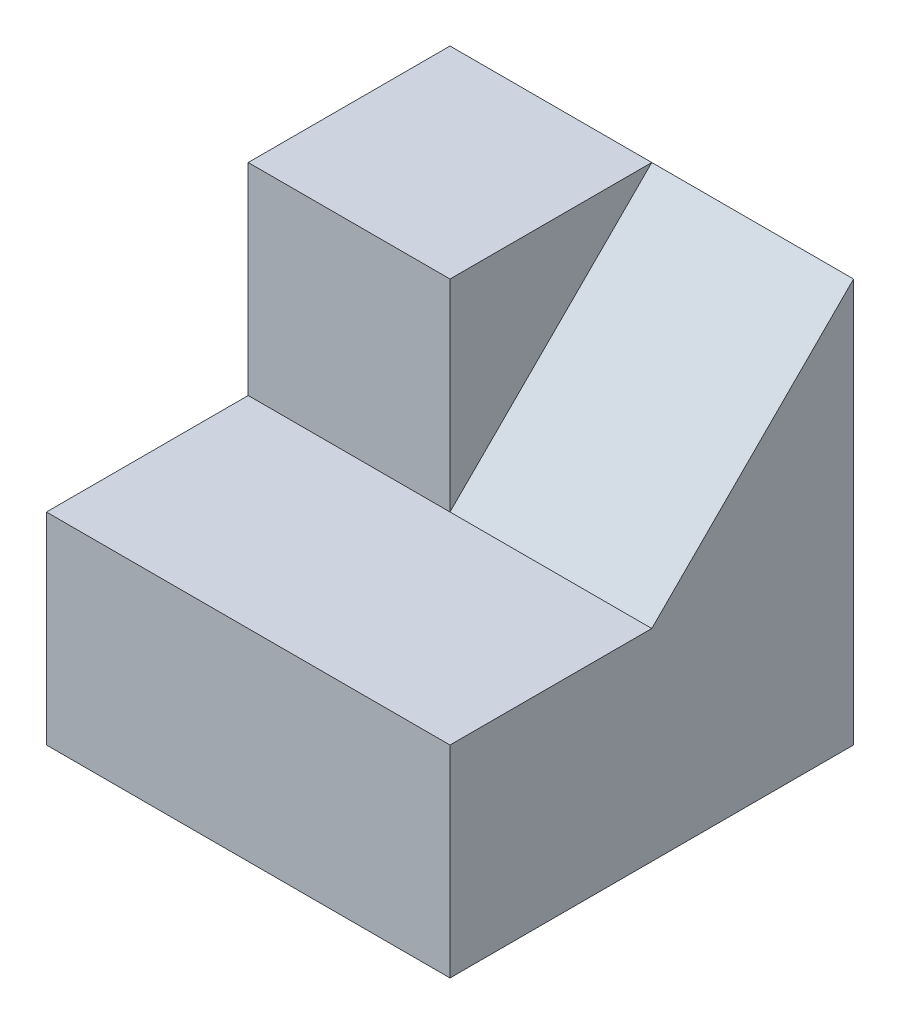
ISO-10303-21;
HEADER;
FILE_DESCRIPTION(('STEP AP214'),'2;1');
FILE_NAME('part.step','',(''),(''),'','','');
FILE_SCHEMA(('AUTOMOTIVE_DESIGN { 1 0 10303 214 1 1 1 1 }'));
ENDSEC;
DATA;
#1=APPLICATION_CONTEXT('core data for automotive mechanical design processes');
#2=APPLICATION_PROTOCOL_DEFINITION('international standard','automotive_design',2000,#1);
#3=PRODUCT_CONTEXT('',#1,'mechanical');
#4=PRODUCT('Part','Part','',(#3));
#5=PRODUCT_RELATED_PRODUCT_CATEGORY('part','',(#4));
#6=PRODUCT_DEFINITION_FORMATION('','',#4);
#7=PRODUCT_DEFINITION_CONTEXT('part definition',#1,'design');
#8=PRODUCT_DEFINITION('design','',#6,#7);
#9=PRODUCT_DEFINITION_SHAPE('','',#8);
#10=(LENGTH_UNIT() NAMED_UNIT(*) SI_UNIT(.MILLI.,.METRE.));
#11=(NAMED_UNIT(*) PLANE_ANGLE_UNIT() SI_UNIT($,.RADIAN.));
#12=(NAMED_UNIT(*) SI_UNIT($,.STERADIAN.) SOLID_ANGLE_UNIT());
#13=UNCERTAINTY_MEASURE_WITH_UNIT(LENGTH_MEASURE(1.E-05),#10,'distance_accuracy_value','');
#14=(GEOMETRIC_REPRESENTATION_CONTEXT(3) GLOBAL_UNCERTAINTY_ASSIGNED_CONTEXT((#13)) GLOBAL_UNIT_ASSIGNED_CONTEXT((#10,
#11,#12)) REPRESENTATION_CONTEXT('',''));
#15=CARTESIAN_POINT('',(0.,0.,0.));
#16=DIRECTION('',(0.,0.,1.));
#17=DIRECTION('',(1.,0.,0.));
#18=AXIS2_PLACEMENT_3D('',#15,#16,#17);
#19=CARTESIAN_POINT('',(20.,20.,-20.));
#20=DIRECTION('',(-1.,0.,0.));
#21=DIRECTION('',(0.,0.,1.));
#22=AXIS2_PLACEMENT_3D('',#19,#20,#21);
#23=PLANE('',#22);
#24=DIRECTION('',(0.,0.,-1.));
#25=VECTOR('',#24,1.);
#26=CARTESIAN_POINT('',(20.,0.,-20.));
#27=LINE('',#26,#25);
#28=CARTESIAN_POINT('',(20.,0.,20.));
#29=VERTEX_POINT('',#28);
#30=CARTESIAN_POINT('',(20.,0.,-20.));
#31=VERTEX_POINT('',#30);
#32=EDGE_CURVE('E95',#29,#31,#27,.T.);
#33=ORIENTED_EDGE('',*,*,#32,.T.);
#34=DIRECTION('',(0.,-1.,0.));
#35=VECTOR('',#34,1.);
#36=CARTESIAN_POINT('',(20.,20.,-20.));
#37=LINE('',#36,#35);
#38=CARTESIAN_POINT('',(20.,40.,-20.));
#39=VERTEX_POINT('',#38);
#40=EDGE_CURVE('E11',#39,#31,#37,.T.);
#41=ORIENTED_EDGE('',*,*,#40,.F.);
#42=DIRECTION('',(0.,-0.707106781186547,0.707106781186548));
#43=VECTOR('',#42,1.);
#44=CARTESIAN_POINT('',(20.,40.,-20.));
#45=LINE('',#44,#43);
#46=CARTESIAN_POINT('',(20.,20.,0.));
#47=VERTEX_POINT('',#46);
#48=EDGE_CURVE('E157',#39,#47,#45,.T.);
#49=ORIENTED_EDGE('',*,*,#48,.T.);
#50=DIRECTION('',(0.,0.,-1.));
#51=VECTOR('',#50,1.);
#52=CARTESIAN_POINT('',(20.,20.,-20.));
#53=LINE('',#52,#51);
#54=CARTESIAN_POINT('',(20.,20.,20.));
#55=VERTEX_POINT('',#54);
#56=EDGE_CURVE('E89',#55,#47,#53,.T.);
#57=ORIENTED_EDGE('',*,*,#56,.F.);
#58=DIRECTION('',(0.,-1.,0.));
#59=VECTOR('',#58,1.);
#60=CARTESIAN_POINT('',(20.,20.,20.));
#61=LINE('',#60,#59);
#62=EDGE_CURVE('E82',#55,#29,#61,.T.);
#63=ORIENTED_EDGE('',*,*,#62,.T.);
#64=EDGE_LOOP('',(#33,#41,#49,#57,#63));
#65=FACE_BOUND('',#64,.T.);
#66=ADVANCED_FACE('F39',(#65),#23,.F.);
#67=CARTESIAN_POINT('',(-20.,20.,-20.));
#68=DIRECTION('',(0.,0.,1.));
#69=DIRECTION('',(1.,0.,0.));
#70=AXIS2_PLACEMENT_3D('',#67,#68,#69);
#71=PLANE('',#70);
#72=DIRECTION('',(-1.,0.,0.));
#73=VECTOR('',#72,1.);
#74=CARTESIAN_POINT('',(-20.,0.,-20.));
#75=LINE('',#74,#73);
#76=CARTESIAN_POINT('',(-20.,0.,-20.));
#77=VERTEX_POINT('',#76);
#78=EDGE_CURVE('E99',#31,#77,#75,.T.);
#79=ORIENTED_EDGE('',*,*,#78,.T.);
#80=DIRECTION('',(0.,-1.,0.));
#81=VECTOR('',#80,1.);
#82=CARTESIAN_POINT('',(-20.,20.,-20.));
#83=LINE('',#82,#81);
#84=CARTESIAN_POINT('',(-20.,40.,-20.));
#85=VERTEX_POINT('',#84);
#86=EDGE_CURVE('E46',#85,#77,#83,.T.);
#87=ORIENTED_EDGE('',*,*,#86,.F.);
#88=DIRECTION('',(-1.,0.,0.));
#89=VECTOR('',#88,1.);
#90=CARTESIAN_POINT('',(-20.,40.,-20.));
#91=LINE('',#90,#89);
#92=CARTESIAN_POINT('',(0.,40.,-20.));
#93=VERTEX_POINT('',#92);
#94=EDGE_CURVE('E124',#93,#85,#91,.T.);
#95=ORIENTED_EDGE('',*,*,#94,.F.);
#96=DIRECTION('',(1.,0.,0.));
#97=VECTOR('',#96,1.);
#98=CARTESIAN_POINT('',(0.,40.,-20.));
#99=LINE('',#98,#97);
#100=EDGE_CURVE('E152',#93,#39,#99,.T.);
#101=ORIENTED_EDGE('',*,*,#100,.T.);
#102=ORIENTED_EDGE('',*,*,#40,.T.);
#103=EDGE_LOOP('',(#79,#87,#95,#101,#102));
#104=FACE_BOUND('',#103,.T.);
#105=ADVANCED_FACE('F121',(#104),#71,.F.);
#106=CARTESIAN_POINT('',(-20.,20.,-20.));
#107=DIRECTION('',(1.,0.,0.));
#108=DIRECTION('',(0.,0.,-1.));
#109=AXIS2_PLACEMENT_3D('',#106,#107,#108);
#110=PLANE('',#109);
#111=DIRECTION('',(0.,0.,1.));
#112=VECTOR('',#111,1.);
#113=CARTESIAN_POINT('',(-20.,0.,-20.));
#114=LINE('',#113,#112);
#115=CARTESIAN_POINT('',(-20.,0.,20.));
#116=VERTEX_POINT('',#115);
#117=EDGE_CURVE('E90',#77,#116,#114,.T.);
#118=ORIENTED_EDGE('',*,*,#117,.T.);
#119=DIRECTION('',(0.,-1.,0.));
#120=VECTOR('',#119,1.);
#121=CARTESIAN_POINT('',(-20.,20.,20.));
#122=LINE('',#121,#120);
#123=CARTESIAN_POINT('',(-20.,20.,20.));
#124=VERTEX_POINT('',#123);
#125=EDGE_CURVE('E85',#124,#116,#122,.T.);
#126=ORIENTED_EDGE('',*,*,#125,.F.);
#127=DIRECTION('',(0.,0.,1.));
#128=VECTOR('',#127,1.);
#129=CARTESIAN_POINT('',(-20.,20.,-20.));
#130=LINE('',#129,#128);
#131=CARTESIAN_POINT('',(-20.,20.,0.));
#132=VERTEX_POINT('',#131);
#133=EDGE_CURVE('E142',#132,#124,#130,.T.);
#134=ORIENTED_EDGE('',*,*,#133,.F.);
#135=DIRECTION('',(0.,-1.,0.));
#136=VECTOR('',#135,1.);
#137=CARTESIAN_POINT('',(-20.,40.,0.));
#138=LINE('',#137,#136);
#139=CARTESIAN_POINT('',(-20.,40.,0.));
#140=VERTEX_POINT('',#139);
#141=EDGE_CURVE('E100',#140,#132,#138,.T.);
#142=ORIENTED_EDGE('',*,*,#141,.F.);
#143=DIRECTION('',(0.,0.,1.));
#144=VECTOR('',#143,1.);
#145=CARTESIAN_POINT('',(-20.,40.,-20.));
#146=LINE('',#145,#144);
#147=EDGE_CURVE('E117',#85,#140,#146,.T.);
#148=ORIENTED_EDGE('',*,*,#147,.F.);
#149=ORIENTED_EDGE('',*,*,#86,.T.);
#150=EDGE_LOOP('',(#118,#126,#134,#142,#148,#149));
#151=FACE_BOUND('',#150,.T.);
#152=ADVANCED_FACE('F114',(#151),#110,.F.);
#153=CARTESIAN_POINT('',(-20.,20.,20.));
#154=DIRECTION('',(0.,0.,-1.));
#155=DIRECTION('',(-1.,0.,0.));
#156=AXIS2_PLACEMENT_3D('',#153,#154,#155);
#157=PLANE('',#156);
#158=DIRECTION('',(1.,0.,0.));
#159=VECTOR('',#158,1.);
#160=CARTESIAN_POINT('',(-20.,0.,20.));
#161=LINE('',#160,#159);
#162=EDGE_CURVE('E79',#116,#29,#161,.T.);
#163=ORIENTED_EDGE('',*,*,#162,.T.);
#164=ORIENTED_EDGE('',*,*,#62,.F.);
#165=DIRECTION('',(1.,0.,0.));
#166=VECTOR('',#165,1.);
#167=CARTESIAN_POINT('',(-20.,20.,20.));
#168=LINE('',#167,#166);
#169=EDGE_CURVE('E60',#124,#55,#168,.T.);
#170=ORIENTED_EDGE('',*,*,#169,.F.);
#171=ORIENTED_EDGE('',*,*,#125,.T.);
#172=EDGE_LOOP('',(#163,#164,#170,#171));
#173=FACE_BOUND('',#172,.T.);
#174=ADVANCED_FACE('F81',(#173),#157,.F.);
#175=CARTESIAN_POINT('',(0.,20.,0.));
#176=DIRECTION('',(0.,1.,0.));
#177=DIRECTION('',(0.,0.,1.));
#178=AXIS2_PLACEMENT_3D('',#175,#176,#177);
#179=PLANE('',#178);
#180=DIRECTION('',(1.,0.,0.));
#181=VECTOR('',#180,1.);
#182=CARTESIAN_POINT('',(0.,20.,0.));
#183=LINE('',#182,#181);
#184=CARTESIAN_POINT('',(0.,20.,0.));
#185=VERTEX_POINT('',#184);
#186=EDGE_CURVE('E140',#185,#47,#183,.T.);
#187=ORIENTED_EDGE('',*,*,#186,.F.);
#188=DIRECTION('',(1.,0.,0.));
#189=VECTOR('',#188,1.);
#190=CARTESIAN_POINT('',(-20.,20.,0.));
#191=LINE('',#190,#189);
#192=EDGE_CURVE('E53',#132,#185,#191,.T.);
#193=ORIENTED_EDGE('',*,*,#192,.F.);
#194=ORIENTED_EDGE('',*,*,#133,.T.);
#195=ORIENTED_EDGE('',*,*,#169,.T.);
#196=ORIENTED_EDGE('',*,*,#56,.T.);
#197=EDGE_LOOP('',(#187,#193,#194,#195,#196));
#198=FACE_BOUND('',#197,.T.);
#199=ADVANCED_FACE('F143',(#198),#179,.T.);
#200=CARTESIAN_POINT('',(0.,0.,0.));
#201=DIRECTION('',(0.,1.,0.));
#202=DIRECTION('',(0.,0.,1.));
#203=AXIS2_PLACEMENT_3D('',#200,#201,#202);
#204=PLANE('',#203);
#205=ORIENTED_EDGE('',*,*,#32,.F.);
#206=ORIENTED_EDGE('',*,*,#162,.F.);
#207=ORIENTED_EDGE('',*,*,#117,.F.);
#208=ORIENTED_EDGE('',*,*,#78,.F.);
#209=EDGE_LOOP('',(#205,#206,#207,#208));
#210=FACE_BOUND('',#209,.T.);
#211=ADVANCED_FACE('F98',(#210),#204,.F.);
#212=CARTESIAN_POINT('',(-20.,40.,0.));
#213=DIRECTION('',(0.,0.,-1.));
#214=DIRECTION('',(-1.,0.,0.));
#215=AXIS2_PLACEMENT_3D('',#212,#213,#214);
#216=PLANE('',#215);
#217=ORIENTED_EDGE('',*,*,#192,.T.);
#218=DIRECTION('',(0.,-1.,0.));
#219=VECTOR('',#218,1.);
#220=CARTESIAN_POINT('',(0.,40.,0.));
#221=LINE('',#220,#219);
#222=CARTESIAN_POINT('',(0.,40.,0.));
#223=VERTEX_POINT('',#222);
#224=EDGE_CURVE('E104',#223,#185,#221,.T.);
#225=ORIENTED_EDGE('',*,*,#224,.F.);
#226=DIRECTION('',(1.,0.,0.));
#227=VECTOR('',#226,1.);
#228=CARTESIAN_POINT('',(-20.,40.,0.));
#229=LINE('',#228,#227);
#230=EDGE_CURVE('E136',#140,#223,#229,.T.);
#231=ORIENTED_EDGE('',*,*,#230,.F.);
#232=ORIENTED_EDGE('',*,*,#141,.T.);
#233=EDGE_LOOP('',(#217,#225,#231,#232));
#234=FACE_BOUND('',#233,.T.);
#235=ADVANCED_FACE('F146',(#234),#216,.F.);
#236=CARTESIAN_POINT('',(0.,40.,-20.));
#237=DIRECTION('',(-1.,0.,0.));
#238=DIRECTION('',(0.,0.,1.));
#239=AXIS2_PLACEMENT_3D('',#236,#237,#238);
#240=PLANE('',#239);
#241=ORIENTED_EDGE('',*,*,#224,.T.);
#242=DIRECTION('',(0.,-0.707106781186547,0.707106781186548));
#243=VECTOR('',#242,1.);
#244=CARTESIAN_POINT('',(0.,40.,-20.));
#245=LINE('',#244,#243);
#246=EDGE_CURVE('E154',#93,#185,#245,.T.);
#247=ORIENTED_EDGE('',*,*,#246,.F.);
#248=DIRECTION('',(0.,0.,-1.));
#249=VECTOR('',#248,1.);
#250=CARTESIAN_POINT('',(0.,40.,-20.));
#251=LINE('',#250,#249);
#252=EDGE_CURVE('E132',#223,#93,#251,.T.);
#253=ORIENTED_EDGE('',*,*,#252,.F.);
#254=EDGE_LOOP('',(#241,#247,#253));
#255=FACE_BOUND('',#254,.T.);
#256=ADVANCED_FACE('F173',(#255),#240,.F.);
#257=CARTESIAN_POINT('',(0.,40.,0.));
#258=DIRECTION('',(0.,1.,0.));
#259=DIRECTION('',(0.,0.,1.));
#260=AXIS2_PLACEMENT_3D('',#257,#258,#259);
#261=PLANE('',#260);
#262=ORIENTED_EDGE('',*,*,#147,.T.);
#263=ORIENTED_EDGE('',*,*,#230,.T.);
#264=ORIENTED_EDGE('',*,*,#252,.T.);
#265=ORIENTED_EDGE('',*,*,#94,.T.);
#266=EDGE_LOOP('',(#262,#263,#264,#265));
#267=FACE_BOUND('',#266,.T.);
#268=ADVANCED_FACE('F128',(#267),#261,.T.);
#269=CARTESIAN_POINT('',(0.,40.,-20.));
#270=DIRECTION('',(0.,0.707106781186548,0.707106781186547));
#271=DIRECTION('',(0.,-0.707106781186547,0.707106781186548));
#272=AXIS2_PLACEMENT_3D('',#269,#270,#271);
#273=PLANE('',#272);
#274=ORIENTED_EDGE('',*,*,#48,.F.);
#275=ORIENTED_EDGE('',*,*,#100,.F.);
#276=ORIENTED_EDGE('',*,*,#246,.T.);
#277=ORIENTED_EDGE('',*,*,#186,.T.);
#278=EDGE_LOOP('',(#274,#275,#276,#277));
#279=FACE_BOUND('',#278,.T.);
#280=ADVANCED_FACE('F164',(#279),#273,.T.);
#281=CLOSED_SHELL('',(#66,#105,#152,#174,#199,#211,#235,#256,#268,#280));
#282=MANIFOLD_SOLID_BREP('B2',#281);
#283=ADVANCED_BREP_SHAPE_REPRESENTATION('',(#18,#282),#14);
#284=SHAPE_DEFINITION_REPRESENTATION(#9,#283);
ENDSEC;
END-ISO-10303-21;
